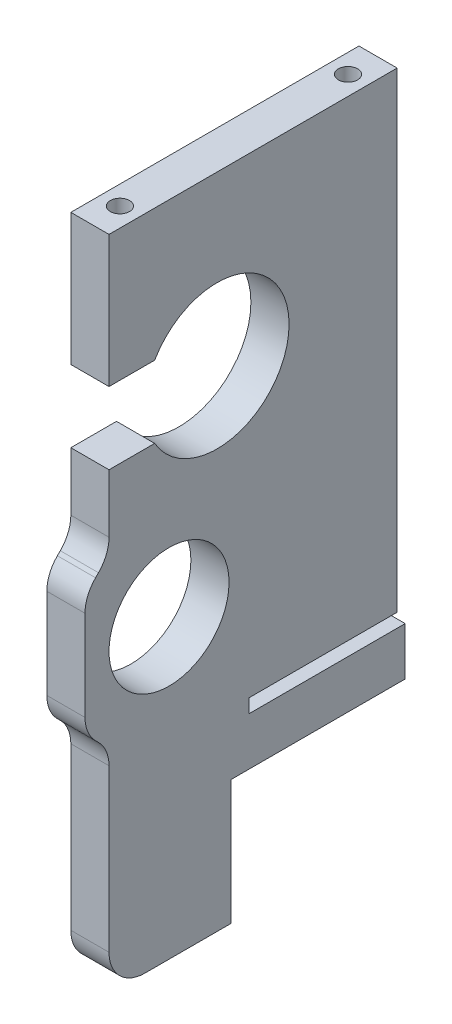
ISO-10303-21;
HEADER;
FILE_DESCRIPTION(('STEP AP214'),'2;1');
FILE_NAME('part.step','',(''),(''),'','','');
FILE_SCHEMA(('AUTOMOTIVE_DESIGN { 1 0 10303 214 1 1 1 1 }'));
ENDSEC;
DATA;
#1=APPLICATION_CONTEXT('core data for automotive mechanical design processes');
#2=APPLICATION_PROTOCOL_DEFINITION('international standard','automotive_design',2000,#1);
#3=PRODUCT_CONTEXT('',#1,'mechanical');
#4=PRODUCT('Part','Part','',(#3));
#5=PRODUCT_RELATED_PRODUCT_CATEGORY('part','',(#4));
#6=PRODUCT_DEFINITION_FORMATION('','',#4);
#7=PRODUCT_DEFINITION_CONTEXT('part definition',#1,'design');
#8=PRODUCT_DEFINITION('design','',#6,#7);
#9=PRODUCT_DEFINITION_SHAPE('','',#8);
#10=(LENGTH_UNIT() NAMED_UNIT(*) SI_UNIT(.MILLI.,.METRE.));
#11=(NAMED_UNIT(*) PLANE_ANGLE_UNIT() SI_UNIT($,.RADIAN.));
#12=(NAMED_UNIT(*) SI_UNIT($,.STERADIAN.) SOLID_ANGLE_UNIT());
#13=UNCERTAINTY_MEASURE_WITH_UNIT(LENGTH_MEASURE(1.E-05),#10,'distance_accuracy_value','');
#14=(GEOMETRIC_REPRESENTATION_CONTEXT(3) GLOBAL_UNCERTAINTY_ASSIGNED_CONTEXT((#13)) GLOBAL_UNIT_ASSIGNED_CONTEXT((#10,
#11,#12)) REPRESENTATION_CONTEXT('',''));
#15=CARTESIAN_POINT('',(0.,0.,0.));
#16=DIRECTION('',(0.,0.,1.));
#17=DIRECTION('',(1.,0.,0.));
#18=AXIS2_PLACEMENT_3D('',#15,#16,#17);
#19=CARTESIAN_POINT('',(3.18,43.8108658985171,0.));
#20=DIRECTION('',(0.,0.,-1.));
#21=DIRECTION('',(1.,0.,0.));
#22=AXIS2_PLACEMENT_3D('',#19,#20,#21);
#23=PLANE('',#22);
#24=DIRECTION('',(0.,1.,0.));
#25=VECTOR('',#24,1.);
#26=CARTESIAN_POINT('',(0.,43.8108658985171,0.));
#27=LINE('',#26,#25);
#28=CARTESIAN_POINT('',(0.,43.8108658985171,0.));
#29=VERTEX_POINT('',#28);
#30=CARTESIAN_POINT('',(0.,54.79,0.));
#31=VERTEX_POINT('',#30);
#32=EDGE_CURVE('E228',#29,#31,#27,.T.);
#33=ORIENTED_EDGE('',*,*,#32,.F.);
#34=DIRECTION('',(-1.,0.,0.));
#35=VECTOR('',#34,1.);
#36=CARTESIAN_POINT('',(3.18,43.8108658985171,0.));
#37=LINE('',#36,#35);
#38=CARTESIAN_POINT('',(3.18,43.8108658985171,0.));
#39=VERTEX_POINT('',#38);
#40=EDGE_CURVE('E280',#39,#29,#37,.T.);
#41=ORIENTED_EDGE('',*,*,#40,.F.);
#42=DIRECTION('',(0.,1.,0.));
#43=VECTOR('',#42,1.);
#44=CARTESIAN_POINT('',(3.18,43.8108658985171,0.));
#45=LINE('',#44,#43);
#46=CARTESIAN_POINT('',(3.18,54.79,0.));
#47=VERTEX_POINT('',#46);
#48=EDGE_CURVE('E231',#39,#47,#45,.T.);
#49=ORIENTED_EDGE('',*,*,#48,.T.);
#50=DIRECTION('',(-1.,0.,0.));
#51=VECTOR('',#50,1.);
#52=CARTESIAN_POINT('',(3.18,54.79,0.));
#53=LINE('',#52,#51);
#54=EDGE_CURVE('E362',#47,#31,#53,.T.);
#55=ORIENTED_EDGE('',*,*,#54,.T.);
#56=EDGE_LOOP('',(#33,#41,#49,#55));
#57=FACE_BOUND('',#56,.T.);
#58=ADVANCED_FACE('F46',(#57),#23,.F.);
#59=CARTESIAN_POINT('',(3.18,54.79,0.));
#60=DIRECTION('',(0.,-1.,0.));
#61=DIRECTION('',(0.,0.,-1.));
#62=AXIS2_PLACEMENT_3D('',#59,#60,#61);
#63=PLANE('',#62);
#64=CARTESIAN_POINT('',(1.59,54.79,-2.50000000000002));
#65=DIRECTION('',(0.,-1.,0.));
#66=DIRECTION('',(0.,0.,1.));
#67=AXIS2_PLACEMENT_3D('',#64,#65,#66);
#68=CIRCLE('',#67,0.8);
#69=CARTESIAN_POINT('',(1.59,54.79,-1.70000000000002));
#70=VERTEX_POINT('',#69);
#71=EDGE_CURVE('E214',#70,#70,#68,.T.);
#72=ORIENTED_EDGE('',*,*,#71,.T.);
#73=EDGE_LOOP('',(#72));
#74=FACE_BOUND('',#73,.T.);
#75=CARTESIAN_POINT('',(1.59,54.79,-21.5));
#76=DIRECTION('',(0.,-1.,0.));
#77=DIRECTION('',(0.,0.,1.));
#78=AXIS2_PLACEMENT_3D('',#75,#76,#77);
#79=CIRCLE('',#78,0.8);
#80=CARTESIAN_POINT('',(1.59,54.79,-20.7));
#81=VERTEX_POINT('',#80);
#82=EDGE_CURVE('E213',#81,#81,#79,.T.);
#83=ORIENTED_EDGE('',*,*,#82,.T.);
#84=EDGE_LOOP('',(#83));
#85=FACE_BOUND('',#84,.T.);
#86=DIRECTION('',(0.,0.,-1.));
#87=VECTOR('',#86,1.);
#88=CARTESIAN_POINT('',(0.,54.79,0.));
#89=LINE('',#88,#87);
#90=CARTESIAN_POINT('',(0.,54.79,-24.));
#91=VERTEX_POINT('',#90);
#92=EDGE_CURVE('E283',#31,#91,#89,.T.);
#93=ORIENTED_EDGE('',*,*,#92,.F.);
#94=ORIENTED_EDGE('',*,*,#54,.F.);
#95=DIRECTION('',(0.,0.,-1.));
#96=VECTOR('',#95,1.);
#97=CARTESIAN_POINT('',(3.18,54.79,0.));
#98=LINE('',#97,#96);
#99=CARTESIAN_POINT('',(3.18,54.79,-24.));
#100=VERTEX_POINT('',#99);
#101=EDGE_CURVE('E234',#47,#100,#98,.T.);
#102=ORIENTED_EDGE('',*,*,#101,.T.);
#103=DIRECTION('',(-1.,0.,0.));
#104=VECTOR('',#103,1.);
#105=CARTESIAN_POINT('',(3.18,54.79,-24.));
#106=LINE('',#105,#104);
#107=EDGE_CURVE('E359',#100,#91,#106,.T.);
#108=ORIENTED_EDGE('',*,*,#107,.T.);
#109=EDGE_LOOP('',(#93,#94,#102,#108));
#110=FACE_BOUND('',#109,.T.);
#111=ADVANCED_FACE('F480',(#74,#85,#110),#63,.F.);
#112=CARTESIAN_POINT('',(3.18,54.79,-24.));
#113=DIRECTION('',(0.,0.,1.));
#114=DIRECTION('',(-1.,0.,0.));
#115=AXIS2_PLACEMENT_3D('',#112,#113,#114);
#116=PLANE('',#115);
#117=DIRECTION('',(0.,-1.,0.));
#118=VECTOR('',#117,1.);
#119=CARTESIAN_POINT('',(0.,54.79,-24.));
#120=LINE('',#119,#118);
#121=CARTESIAN_POINT('',(0.,15.53,-24.));
#122=VERTEX_POINT('',#121);
#123=EDGE_CURVE('E286',#91,#122,#120,.T.);
#124=ORIENTED_EDGE('',*,*,#123,.F.);
#125=ORIENTED_EDGE('',*,*,#107,.F.);
#126=DIRECTION('',(0.,-1.,0.));
#127=VECTOR('',#126,1.);
#128=CARTESIAN_POINT('',(3.18,54.79,-24.));
#129=LINE('',#128,#127);
#130=CARTESIAN_POINT('',(3.18,15.53,-24.));
#131=VERTEX_POINT('',#130);
#132=EDGE_CURVE('E238',#100,#131,#129,.T.);
#133=ORIENTED_EDGE('',*,*,#132,.T.);
#134=DIRECTION('',(-1.,0.,0.));
#135=VECTOR('',#134,1.);
#136=CARTESIAN_POINT('',(3.18,15.53,-24.));
#137=LINE('',#136,#135);
#138=EDGE_CURVE('E356',#131,#122,#137,.T.);
#139=ORIENTED_EDGE('',*,*,#138,.T.);
#140=EDGE_LOOP('',(#124,#125,#133,#139));
#141=FACE_BOUND('',#140,.T.);
#142=ADVANCED_FACE('F475',(#141),#116,.F.);
#143=CARTESIAN_POINT('',(3.18,15.53,-11.67));
#144=DIRECTION('',(0.,-1.,0.));
#145=DIRECTION('',(0.,0.,-1.));
#146=AXIS2_PLACEMENT_3D('',#143,#144,#145);
#147=PLANE('',#146);
#148=DIRECTION('',(0.,0.,-1.));
#149=VECTOR('',#148,1.);
#150=CARTESIAN_POINT('',(0.,15.53,-11.67));
#151=LINE('',#150,#149);
#152=CARTESIAN_POINT('',(0.,15.53,-11.67));
#153=VERTEX_POINT('',#152);
#154=EDGE_CURVE('E289',#153,#122,#151,.T.);
#155=ORIENTED_EDGE('',*,*,#154,.T.);
#156=ORIENTED_EDGE('',*,*,#138,.F.);
#157=DIRECTION('',(0.,0.,-1.));
#158=VECTOR('',#157,1.);
#159=CARTESIAN_POINT('',(3.18,15.53,-11.67));
#160=LINE('',#159,#158);
#161=CARTESIAN_POINT('',(3.18,15.53,-11.67));
#162=VERTEX_POINT('',#161);
#163=EDGE_CURVE('E241',#162,#131,#160,.T.);
#164=ORIENTED_EDGE('',*,*,#163,.F.);
#165=DIRECTION('',(-1.,0.,0.));
#166=VECTOR('',#165,1.);
#167=CARTESIAN_POINT('',(3.18,15.53,-11.67));
#168=LINE('',#167,#166);
#169=EDGE_CURVE('E353',#162,#153,#168,.T.);
#170=ORIENTED_EDGE('',*,*,#169,.T.);
#171=EDGE_LOOP('',(#155,#156,#164,#170));
#172=FACE_BOUND('',#171,.T.);
#173=ADVANCED_FACE('F472',(#172),#147,.T.);
#174=CARTESIAN_POINT('',(3.18,15.53,-11.67));
#175=DIRECTION('',(0.,0.,1.));
#176=DIRECTION('',(0.,-1.,0.));
#177=AXIS2_PLACEMENT_3D('',#174,#175,#176);
#178=PLANE('',#177);
#179=DIRECTION('',(0.,-1.,0.));
#180=VECTOR('',#179,1.);
#181=CARTESIAN_POINT('',(0.,15.53,-11.67));
#182=LINE('',#181,#180);
#183=CARTESIAN_POINT('',(0.,14.38,-11.67));
#184=VERTEX_POINT('',#183);
#185=EDGE_CURVE('E291',#153,#184,#182,.T.);
#186=ORIENTED_EDGE('',*,*,#185,.F.);
#187=ORIENTED_EDGE('',*,*,#169,.F.);
#188=DIRECTION('',(0.,-1.,0.));
#189=VECTOR('',#188,1.);
#190=CARTESIAN_POINT('',(3.18,15.53,-11.67));
#191=LINE('',#190,#189);
#192=CARTESIAN_POINT('',(3.18,14.38,-11.67));
#193=VERTEX_POINT('',#192);
#194=EDGE_CURVE('E243',#162,#193,#191,.T.);
#195=ORIENTED_EDGE('',*,*,#194,.T.);
#196=DIRECTION('',(-1.,0.,0.));
#197=VECTOR('',#196,1.);
#198=CARTESIAN_POINT('',(3.18,14.38,-11.67));
#199=LINE('',#198,#197);
#200=EDGE_CURVE('E350',#193,#184,#199,.T.);
#201=ORIENTED_EDGE('',*,*,#200,.T.);
#202=EDGE_LOOP('',(#186,#187,#195,#201));
#203=FACE_BOUND('',#202,.T.);
#204=ADVANCED_FACE('F469',(#203),#178,.F.);
#205=CARTESIAN_POINT('',(3.18,14.38,-24.67));
#206=DIRECTION('',(0.,1.,0.));
#207=DIRECTION('',(0.,0.,1.));
#208=AXIS2_PLACEMENT_3D('',#205,#206,#207);
#209=PLANE('',#208);
#210=DIRECTION('',(0.,0.,1.));
#211=VECTOR('',#210,1.);
#212=CARTESIAN_POINT('',(0.,14.38,-24.67));
#213=LINE('',#212,#211);
#214=CARTESIAN_POINT('',(0.,14.38,-24.67));
#215=VERTEX_POINT('',#214);
#216=EDGE_CURVE('E294',#215,#184,#213,.T.);
#217=ORIENTED_EDGE('',*,*,#216,.T.);
#218=ORIENTED_EDGE('',*,*,#200,.F.);
#219=DIRECTION('',(0.,0.,1.));
#220=VECTOR('',#219,1.);
#221=CARTESIAN_POINT('',(3.18,14.38,-24.67));
#222=LINE('',#221,#220);
#223=CARTESIAN_POINT('',(3.18,14.38,-24.67));
#224=VERTEX_POINT('',#223);
#225=EDGE_CURVE('E246',#224,#193,#222,.T.);
#226=ORIENTED_EDGE('',*,*,#225,.F.);
#227=DIRECTION('',(-1.,0.,0.));
#228=VECTOR('',#227,1.);
#229=CARTESIAN_POINT('',(3.18,14.38,-24.67));
#230=LINE('',#229,#228);
#231=EDGE_CURVE('E347',#224,#215,#230,.T.);
#232=ORIENTED_EDGE('',*,*,#231,.T.);
#233=EDGE_LOOP('',(#217,#218,#226,#232));
#234=FACE_BOUND('',#233,.T.);
#235=ADVANCED_FACE('F464',(#234),#209,.T.);
#236=CARTESIAN_POINT('',(3.18,14.38,-24.67));
#237=DIRECTION('',(0.,0.,1.));
#238=DIRECTION('',(0.,-1.,0.));
#239=AXIS2_PLACEMENT_3D('',#236,#237,#238);
#240=PLANE('',#239);
#241=DIRECTION('',(0.,-1.,0.));
#242=VECTOR('',#241,1.);
#243=CARTESIAN_POINT('',(0.,14.38,-24.67));
#244=LINE('',#243,#242);
#245=CARTESIAN_POINT('',(0.,10.38,-24.67));
#246=VERTEX_POINT('',#245);
#247=EDGE_CURVE('E296',#215,#246,#244,.T.);
#248=ORIENTED_EDGE('',*,*,#247,.F.);
#249=ORIENTED_EDGE('',*,*,#231,.F.);
#250=DIRECTION('',(0.,-1.,0.));
#251=VECTOR('',#250,1.);
#252=CARTESIAN_POINT('',(3.18,14.38,-24.67));
#253=LINE('',#252,#251);
#254=CARTESIAN_POINT('',(3.18,10.38,-24.67));
#255=VERTEX_POINT('',#254);
#256=EDGE_CURVE('E248',#224,#255,#253,.T.);
#257=ORIENTED_EDGE('',*,*,#256,.T.);
#258=DIRECTION('',(-1.,0.,0.));
#259=VECTOR('',#258,1.);
#260=CARTESIAN_POINT('',(3.18,10.38,-24.67));
#261=LINE('',#260,#259);
#262=EDGE_CURVE('E344',#255,#246,#261,.T.);
#263=ORIENTED_EDGE('',*,*,#262,.T.);
#264=EDGE_LOOP('',(#248,#249,#257,#263));
#265=FACE_BOUND('',#264,.T.);
#266=ADVANCED_FACE('F459',(#265),#240,.F.);
#267=CARTESIAN_POINT('',(3.18,10.38,-10.17));
#268=DIRECTION('',(0.,-1.,0.));
#269=DIRECTION('',(0.,0.,-1.));
#270=AXIS2_PLACEMENT_3D('',#267,#268,#269);
#271=PLANE('',#270);
#272=DIRECTION('',(0.,0.,-1.));
#273=VECTOR('',#272,1.);
#274=CARTESIAN_POINT('',(0.,10.38,-10.17));
#275=LINE('',#274,#273);
#276=CARTESIAN_POINT('',(0.,10.38,-10.17));
#277=VERTEX_POINT('',#276);
#278=EDGE_CURVE('E299',#277,#246,#275,.T.);
#279=ORIENTED_EDGE('',*,*,#278,.T.);
#280=ORIENTED_EDGE('',*,*,#262,.F.);
#281=DIRECTION('',(0.,0.,-1.));
#282=VECTOR('',#281,1.);
#283=CARTESIAN_POINT('',(3.18,10.38,-10.17));
#284=LINE('',#283,#282);
#285=CARTESIAN_POINT('',(3.18,10.38,-10.17));
#286=VERTEX_POINT('',#285);
#287=EDGE_CURVE('E251',#286,#255,#284,.T.);
#288=ORIENTED_EDGE('',*,*,#287,.F.);
#289=DIRECTION('',(-1.,0.,0.));
#290=VECTOR('',#289,1.);
#291=CARTESIAN_POINT('',(3.18,10.38,-10.17));
#292=LINE('',#291,#290);
#293=EDGE_CURVE('E341',#286,#277,#292,.T.);
#294=ORIENTED_EDGE('',*,*,#293,.T.);
#295=EDGE_LOOP('',(#279,#280,#288,#294));
#296=FACE_BOUND('',#295,.T.);
#297=ADVANCED_FACE('F456',(#296),#271,.T.);
#298=CARTESIAN_POINT('',(3.18,0.,-10.17));
#299=DIRECTION('',(0.,0.,-1.));
#300=DIRECTION('',(0.,1.,0.));
#301=AXIS2_PLACEMENT_3D('',#298,#299,#300);
#302=PLANE('',#301);
#303=DIRECTION('',(0.,1.,0.));
#304=VECTOR('',#303,1.);
#305=CARTESIAN_POINT('',(0.,0.,-10.17));
#306=LINE('',#305,#304);
#307=CARTESIAN_POINT('',(0.,0.,-10.17));
#308=VERTEX_POINT('',#307);
#309=EDGE_CURVE('E301',#308,#277,#306,.T.);
#310=ORIENTED_EDGE('',*,*,#309,.T.);
#311=ORIENTED_EDGE('',*,*,#293,.F.);
#312=DIRECTION('',(0.,1.,0.));
#313=VECTOR('',#312,1.);
#314=CARTESIAN_POINT('',(3.18,0.,-10.17));
#315=LINE('',#314,#313);
#316=CARTESIAN_POINT('',(3.18,0.,-10.17));
#317=VERTEX_POINT('',#316);
#318=EDGE_CURVE('E253',#317,#286,#315,.T.);
#319=ORIENTED_EDGE('',*,*,#318,.F.);
#320=DIRECTION('',(-1.,0.,0.));
#321=VECTOR('',#320,1.);
#322=CARTESIAN_POINT('',(3.18,0.,-10.17));
#323=LINE('',#322,#321);
#324=EDGE_CURVE('E338',#317,#308,#323,.T.);
#325=ORIENTED_EDGE('',*,*,#324,.T.);
#326=EDGE_LOOP('',(#310,#311,#319,#325));
#327=FACE_BOUND('',#326,.T.);
#328=ADVANCED_FACE('F451',(#327),#302,.T.);
#329=CARTESIAN_POINT('',(3.18,0.,-10.17));
#330=DIRECTION('',(0.,1.,0.));
#331=DIRECTION('',(0.,0.,1.));
#332=AXIS2_PLACEMENT_3D('',#329,#330,#331);
#333=PLANE('',#332);
#334=DIRECTION('',(0.,0.,1.));
#335=VECTOR('',#334,1.);
#336=CARTESIAN_POINT('',(0.,0.,-10.17));
#337=LINE('',#336,#335);
#338=CARTESIAN_POINT('',(0.,0.,-3.));
#339=VERTEX_POINT('',#338);
#340=EDGE_CURVE('E303',#308,#339,#337,.T.);
#341=ORIENTED_EDGE('',*,*,#340,.F.);
#342=ORIENTED_EDGE('',*,*,#324,.F.);
#343=DIRECTION('',(0.,0.,1.));
#344=VECTOR('',#343,1.);
#345=CARTESIAN_POINT('',(3.18,0.,-10.17));
#346=LINE('',#345,#344);
#347=CARTESIAN_POINT('',(3.18,0.,-3.));
#348=VERTEX_POINT('',#347);
#349=EDGE_CURVE('E255',#317,#348,#346,.T.);
#350=ORIENTED_EDGE('',*,*,#349,.T.);
#351=DIRECTION('',(-1.,0.,0.));
#352=VECTOR('',#351,1.);
#353=CARTESIAN_POINT('',(3.18,0.,-3.));
#354=LINE('',#353,#352);
#355=EDGE_CURVE('E377',#339,#348,#354,.F.);
#356=ORIENTED_EDGE('',*,*,#355,.F.);
#357=EDGE_LOOP('',(#341,#342,#350,#356));
#358=FACE_BOUND('',#357,.T.);
#359=ADVANCED_FACE('F446',(#358),#333,.F.);
#360=CARTESIAN_POINT('',(3.18,17.7,0.));
#361=DIRECTION('',(0.,0.,1.));
#362=DIRECTION('',(0.,-1.,0.));
#363=AXIS2_PLACEMENT_3D('',#360,#361,#362);
#364=PLANE('',#363);
#365=DIRECTION('',(0.,-1.,0.));
#366=VECTOR('',#365,1.);
#367=CARTESIAN_POINT('',(3.18,17.7,0.));
#368=LINE('',#367,#366);
#369=CARTESIAN_POINT('',(3.18,16.4573593128807,0.));
#370=VERTEX_POINT('',#369);
#371=CARTESIAN_POINT('',(3.18,3.,0.));
#372=VERTEX_POINT('',#371);
#373=EDGE_CURVE('E258',#370,#372,#368,.T.);
#374=ORIENTED_EDGE('',*,*,#373,.F.);
#375=DIRECTION('',(-1.,0.,0.));
#376=VECTOR('',#375,1.);
#377=CARTESIAN_POINT('',(3.18,16.4573593128807,0.));
#378=LINE('',#377,#376);
#379=CARTESIAN_POINT('',(0.,16.4573593128807,0.));
#380=VERTEX_POINT('',#379);
#381=EDGE_CURVE('E365',#380,#370,#378,.F.);
#382=ORIENTED_EDGE('',*,*,#381,.F.);
#383=DIRECTION('',(0.,-1.,0.));
#384=VECTOR('',#383,1.);
#385=CARTESIAN_POINT('',(0.,17.7,0.));
#386=LINE('',#385,#384);
#387=CARTESIAN_POINT('',(0.,3.,0.));
#388=VERTEX_POINT('',#387);
#389=EDGE_CURVE('E306',#380,#388,#386,.T.);
#390=ORIENTED_EDGE('',*,*,#389,.T.);
#391=DIRECTION('',(-1.,0.,0.));
#392=VECTOR('',#391,1.);
#393=CARTESIAN_POINT('',(0.,3.,0.));
#394=LINE('',#393,#392);
#395=EDGE_CURVE('E368',#372,#388,#394,.T.);
#396=ORIENTED_EDGE('',*,*,#395,.F.);
#397=EDGE_LOOP('',(#374,#382,#390,#396));
#398=FACE_BOUND('',#397,.T.);
#399=ADVANCED_FACE('F440',(#398),#364,.T.);
#400=CARTESIAN_POINT('',(3.18,19.7,2.));
#401=DIRECTION('',(0.,-0.707106781186557,0.707106781186538));
#402=DIRECTION('',(0.,-0.707106781186538,-0.707106781186557));
#403=AXIS2_PLACEMENT_3D('',#400,#401,#402);
#404=PLANE('',#403);
#405=DIRECTION('',(0.,-0.707106781186538,-0.707106781186557));
#406=VECTOR('',#405,1.);
#407=CARTESIAN_POINT('',(3.18,19.7,2.));
#408=LINE('',#407,#406);
#409=CARTESIAN_POINT('',(3.18,18.8213203435596,1.12132034355961));
#410=VERTEX_POINT('',#409);
#411=CARTESIAN_POINT('',(3.18,18.5786796564404,0.878679656440382));
#412=VERTEX_POINT('',#411);
#413=EDGE_CURVE('E261',#410,#412,#408,.T.);
#414=ORIENTED_EDGE('',*,*,#413,.F.);
#415=DIRECTION('',(-1.,0.,0.));
#416=VECTOR('',#415,1.);
#417=CARTESIAN_POINT('',(3.18,18.8213203435596,1.12132034355961));
#418=LINE('',#417,#416);
#419=CARTESIAN_POINT('',(0.,18.8213203435596,1.12132034355961));
#420=VERTEX_POINT('',#419);
#421=EDGE_CURVE('E386',#420,#410,#418,.F.);
#422=ORIENTED_EDGE('',*,*,#421,.F.);
#423=DIRECTION('',(0.,-0.707106781186538,-0.707106781186557));
#424=VECTOR('',#423,1.);
#425=CARTESIAN_POINT('',(0.,19.7,2.));
#426=LINE('',#425,#424);
#427=CARTESIAN_POINT('',(0.,18.5786796564404,0.878679656440382));
#428=VERTEX_POINT('',#427);
#429=EDGE_CURVE('E309',#420,#428,#426,.T.);
#430=ORIENTED_EDGE('',*,*,#429,.T.);
#431=DIRECTION('',(-1.,0.,0.));
#432=VECTOR('',#431,1.);
#433=CARTESIAN_POINT('',(0.,18.5786796564404,0.878679656440383));
#434=LINE('',#433,#432);
#435=EDGE_CURVE('E389',#412,#428,#434,.T.);
#436=ORIENTED_EDGE('',*,*,#435,.F.);
#437=EDGE_LOOP('',(#414,#422,#430,#436));
#438=FACE_BOUND('',#437,.T.);
#439=ADVANCED_FACE('F433',(#438),#404,.T.);
#440=CARTESIAN_POINT('',(3.18,19.7,2.));
#441=DIRECTION('',(0.,0.,-1.));
#442=DIRECTION('',(0.,1.,0.));
#443=AXIS2_PLACEMENT_3D('',#440,#441,#442);
#444=PLANE('',#443);
#445=DIRECTION('',(0.,1.,0.));
#446=VECTOR('',#445,1.);
#447=CARTESIAN_POINT('',(3.18,19.7,2.));
#448=LINE('',#447,#446);
#449=CARTESIAN_POINT('',(3.18,20.9426406871193,2.));
#450=VERTEX_POINT('',#449);
#451=CARTESIAN_POINT('',(3.18,28.4573593128807,2.));
#452=VERTEX_POINT('',#451);
#453=EDGE_CURVE('E264',#450,#452,#448,.T.);
#454=ORIENTED_EDGE('',*,*,#453,.T.);
#455=DIRECTION('',(-1.,0.,0.));
#456=VECTOR('',#455,1.);
#457=CARTESIAN_POINT('',(3.18,28.4573593128807,2.));
#458=LINE('',#457,#456);
#459=CARTESIAN_POINT('',(0.,28.4573593128807,2.));
#460=VERTEX_POINT('',#459);
#461=EDGE_CURVE('E392',#460,#452,#458,.F.);
#462=ORIENTED_EDGE('',*,*,#461,.F.);
#463=DIRECTION('',(0.,1.,0.));
#464=VECTOR('',#463,1.);
#465=CARTESIAN_POINT('',(0.,19.7,2.));
#466=LINE('',#465,#464);
#467=CARTESIAN_POINT('',(0.,20.9426406871193,2.));
#468=VERTEX_POINT('',#467);
#469=EDGE_CURVE('E312',#468,#460,#466,.T.);
#470=ORIENTED_EDGE('',*,*,#469,.F.);
#471=DIRECTION('',(-1.,0.,0.));
#472=VECTOR('',#471,1.);
#473=CARTESIAN_POINT('',(0.,20.9426406871193,2.));
#474=LINE('',#473,#472);
#475=EDGE_CURVE('E395',#450,#468,#474,.T.);
#476=ORIENTED_EDGE('',*,*,#475,.F.);
#477=EDGE_LOOP('',(#454,#462,#470,#476));
#478=FACE_BOUND('',#477,.T.);
#479=ADVANCED_FACE('F425',(#478),#444,.F.);
#480=CARTESIAN_POINT('',(3.18,29.7,2.));
#481=DIRECTION('',(0.,-0.707106781186556,-0.707106781186539));
#482=DIRECTION('',(0.,0.707106781186539,-0.707106781186556));
#483=AXIS2_PLACEMENT_3D('',#480,#481,#482);
#484=PLANE('',#483);
#485=DIRECTION('',(0.,0.707106781186539,-0.707106781186556));
#486=VECTOR('',#485,1.);
#487=CARTESIAN_POINT('',(3.18,29.7,2.));
#488=LINE('',#487,#486);
#489=CARTESIAN_POINT('',(3.18,30.5786796564404,1.12132034355961));
#490=VERTEX_POINT('',#489);
#491=CARTESIAN_POINT('',(3.18,30.8213203435596,0.878679656440383));
#492=VERTEX_POINT('',#491);
#493=EDGE_CURVE('E267',#490,#492,#488,.T.);
#494=ORIENTED_EDGE('',*,*,#493,.T.);
#495=DIRECTION('',(-1.,0.,0.));
#496=VECTOR('',#495,1.);
#497=CARTESIAN_POINT('',(3.18,30.8213203435596,0.878679656440383));
#498=LINE('',#497,#496);
#499=CARTESIAN_POINT('',(0.,30.8213203435596,0.878679656440383));
#500=VERTEX_POINT('',#499);
#501=EDGE_CURVE('E398',#500,#492,#498,.F.);
#502=ORIENTED_EDGE('',*,*,#501,.F.);
#503=DIRECTION('',(0.,0.707106781186539,-0.707106781186556));
#504=VECTOR('',#503,1.);
#505=CARTESIAN_POINT('',(0.,29.7,2.));
#506=LINE('',#505,#504);
#507=CARTESIAN_POINT('',(0.,30.5786796564404,1.12132034355961));
#508=VERTEX_POINT('',#507);
#509=EDGE_CURVE('E315',#508,#500,#506,.T.);
#510=ORIENTED_EDGE('',*,*,#509,.F.);
#511=DIRECTION('',(-1.,0.,0.));
#512=VECTOR('',#511,1.);
#513=CARTESIAN_POINT('',(3.18,30.5786796564404,1.12132034355961));
#514=LINE('',#513,#512);
#515=EDGE_CURVE('E400',#490,#508,#514,.T.);
#516=ORIENTED_EDGE('',*,*,#515,.F.);
#517=EDGE_LOOP('',(#494,#502,#510,#516));
#518=FACE_BOUND('',#517,.T.);
#519=ADVANCED_FACE('F416',(#518),#484,.F.);
#520=CARTESIAN_POINT('',(3.18,31.6999999999999,0.));
#521=DIRECTION('',(0.,0.,-1.));
#522=DIRECTION('',(0.,1.,0.));
#523=AXIS2_PLACEMENT_3D('',#520,#521,#522);
#524=PLANE('',#523);
#525=DIRECTION('',(0.,1.,0.));
#526=VECTOR('',#525,1.);
#527=CARTESIAN_POINT('',(3.18,31.6999999999999,0.));
#528=LINE('',#527,#526);
#529=CARTESIAN_POINT('',(3.18,32.9426406871193,0.));
#530=VERTEX_POINT('',#529);
#531=CARTESIAN_POINT('',(3.18,37.8108658985171,0.));
#532=VERTEX_POINT('',#531);
#533=EDGE_CURVE('E270',#530,#532,#528,.T.);
#534=ORIENTED_EDGE('',*,*,#533,.T.);
#535=DIRECTION('',(-1.,0.,0.));
#536=VECTOR('',#535,1.);
#537=CARTESIAN_POINT('',(3.18,37.8108658985171,0.));
#538=LINE('',#537,#536);
#539=CARTESIAN_POINT('',(0.,37.8108658985171,0.));
#540=VERTEX_POINT('',#539);
#541=EDGE_CURVE('E335',#532,#540,#538,.T.);
#542=ORIENTED_EDGE('',*,*,#541,.T.);
#543=DIRECTION('',(0.,1.,0.));
#544=VECTOR('',#543,1.);
#545=CARTESIAN_POINT('',(0.,31.6999999999999,0.));
#546=LINE('',#545,#544);
#547=CARTESIAN_POINT('',(0.,32.9426406871193,0.));
#548=VERTEX_POINT('',#547);
#549=EDGE_CURVE('E318',#548,#540,#546,.T.);
#550=ORIENTED_EDGE('',*,*,#549,.F.);
#551=DIRECTION('',(-1.,0.,0.));
#552=VECTOR('',#551,1.);
#553=CARTESIAN_POINT('',(0.,32.9426406871193,0.));
#554=LINE('',#553,#552);
#555=EDGE_CURVE('E403',#530,#548,#554,.T.);
#556=ORIENTED_EDGE('',*,*,#555,.F.);
#557=EDGE_LOOP('',(#534,#542,#550,#556));
#558=FACE_BOUND('',#557,.T.);
#559=ADVANCED_FACE('F495',(#558),#524,.F.);
#560=CARTESIAN_POINT('',(3.18,37.8108658985171,-3.80384757729332));
#561=DIRECTION('',(0.,1.,0.));
#562=DIRECTION('',(0.,0.,1.));
#563=AXIS2_PLACEMENT_3D('',#560,#561,#562);
#564=PLANE('',#563);
#565=DIRECTION('',(0.,0.,1.));
#566=VECTOR('',#565,1.);
#567=CARTESIAN_POINT('',(0.,37.8108658985171,-3.80384757729332));
#568=LINE('',#567,#566);
#569=CARTESIAN_POINT('',(0.,37.8108658985171,-3.80384757729332));
#570=VERTEX_POINT('',#569);
#571=EDGE_CURVE('E321',#570,#540,#568,.T.);
#572=ORIENTED_EDGE('',*,*,#571,.T.);
#573=ORIENTED_EDGE('',*,*,#541,.F.);
#574=DIRECTION('',(0.,0.,1.));
#575=VECTOR('',#574,1.);
#576=CARTESIAN_POINT('',(3.18,37.8108658985171,-3.80384757729332));
#577=LINE('',#576,#575);
#578=CARTESIAN_POINT('',(3.18,37.8108658985171,-3.80384757729332));
#579=VERTEX_POINT('',#578);
#580=EDGE_CURVE('E273',#579,#532,#577,.T.);
#581=ORIENTED_EDGE('',*,*,#580,.F.);
#582=DIRECTION('',(-1.,0.,0.));
#583=VECTOR('',#582,1.);
#584=CARTESIAN_POINT('',(3.18,37.8108658985171,-3.80384757729332));
#585=LINE('',#584,#583);
#586=EDGE_CURVE('E332',#579,#570,#585,.T.);
#587=ORIENTED_EDGE('',*,*,#586,.T.);
#588=EDGE_LOOP('',(#572,#573,#581,#587));
#589=FACE_BOUND('',#588,.T.);
#590=ADVANCED_FACE('F493',(#589),#564,.T.);
#591=CARTESIAN_POINT('',(3.18,40.8108658985171,-8.99999999999995));
#592=DIRECTION('',(-1.,0.,0.));
#593=DIRECTION('',(0.,0.,-1.));
#594=AXIS2_PLACEMENT_3D('',#591,#592,#593);
#595=CYLINDRICAL_SURFACE('',#594,6.);
#596=CARTESIAN_POINT('',(0.,40.8108658985171,-8.99999999999995));
#597=DIRECTION('',(1.,0.,0.));
#598=DIRECTION('',(0.,0.,-1.));
#599=AXIS2_PLACEMENT_3D('',#596,#597,#598);
#600=CIRCLE('',#599,6.);
#601=CARTESIAN_POINT('',(0.,43.8108658985171,-3.80384757729332));
#602=VERTEX_POINT('',#601);
#603=EDGE_CURVE('E323',#570,#602,#600,.T.);
#604=ORIENTED_EDGE('',*,*,#603,.F.);
#605=ORIENTED_EDGE('',*,*,#586,.F.);
#606=CARTESIAN_POINT('',(3.18,40.8108658985171,-8.99999999999995));
#607=DIRECTION('',(1.,0.,0.));
#608=DIRECTION('',(0.,0.,-1.));
#609=AXIS2_PLACEMENT_3D('',#606,#607,#608);
#610=CIRCLE('',#609,6.);
#611=CARTESIAN_POINT('',(3.18,43.8108658985171,-3.80384757729332));
#612=VERTEX_POINT('',#611);
#613=EDGE_CURVE('E275',#579,#612,#610,.T.);
#614=ORIENTED_EDGE('',*,*,#613,.T.);
#615=DIRECTION('',(-1.,0.,0.));
#616=VECTOR('',#615,1.);
#617=CARTESIAN_POINT('',(3.18,43.8108658985171,-3.80384757729332));
#618=LINE('',#617,#616);
#619=EDGE_CURVE('E329',#612,#602,#618,.T.);
#620=ORIENTED_EDGE('',*,*,#619,.T.);
#621=EDGE_LOOP('',(#604,#605,#614,#620));
#622=FACE_BOUND('',#621,.T.);
#623=ADVANCED_FACE('F490',(#622),#595,.F.);
#624=CARTESIAN_POINT('',(3.18,43.8108658985171,-3.80384757729331));
#625=DIRECTION('',(0.,1.,0.));
#626=DIRECTION('',(0.,0.,1.));
#627=AXIS2_PLACEMENT_3D('',#624,#625,#626);
#628=PLANE('',#627);
#629=DIRECTION('',(0.,0.,1.));
#630=VECTOR('',#629,1.);
#631=CARTESIAN_POINT('',(0.,43.8108658985171,-3.80384757729331));
#632=LINE('',#631,#630);
#633=EDGE_CURVE('E235',#602,#29,#632,.T.);
#634=ORIENTED_EDGE('',*,*,#633,.F.);
#635=ORIENTED_EDGE('',*,*,#619,.F.);
#636=DIRECTION('',(0.,0.,1.));
#637=VECTOR('',#636,1.);
#638=CARTESIAN_POINT('',(3.18,43.8108658985171,-3.80384757729331));
#639=LINE('',#638,#637);
#640=EDGE_CURVE('E278',#612,#39,#639,.T.);
#641=ORIENTED_EDGE('',*,*,#640,.T.);
#642=ORIENTED_EDGE('',*,*,#40,.T.);
#643=EDGE_LOOP('',(#634,#635,#641,#642));
#644=FACE_BOUND('',#643,.T.);
#645=ADVANCED_FACE('F484',(#644),#628,.F.);
#646=CARTESIAN_POINT('',(3.18,40.8108658985171,-8.99999999999995));
#647=DIRECTION('',(-1.,0.,0.));
#648=DIRECTION('',(0.,0.,-1.));
#649=AXIS2_PLACEMENT_3D('',#646,#647,#648);
#650=PLANE('',#649);
#651=CARTESIAN_POINT('',(3.18,24.7,-5.));
#652=DIRECTION('',(1.,0.,0.));
#653=DIRECTION('',(0.,0.,-1.));
#654=AXIS2_PLACEMENT_3D('',#651,#652,#653);
#655=CIRCLE('',#654,5.);
#656=CARTESIAN_POINT('',(3.18,24.7,-10.));
#657=VERTEX_POINT('',#656);
#658=EDGE_CURVE('E225',#657,#657,#655,.T.);
#659=ORIENTED_EDGE('',*,*,#658,.F.);
#660=EDGE_LOOP('',(#659));
#661=FACE_BOUND('',#660,.T.);
#662=ORIENTED_EDGE('',*,*,#349,.F.);
#663=ORIENTED_EDGE('',*,*,#318,.T.);
#664=ORIENTED_EDGE('',*,*,#287,.T.);
#665=ORIENTED_EDGE('',*,*,#256,.F.);
#666=ORIENTED_EDGE('',*,*,#225,.T.);
#667=ORIENTED_EDGE('',*,*,#194,.F.);
#668=ORIENTED_EDGE('',*,*,#163,.T.);
#669=ORIENTED_EDGE('',*,*,#132,.F.);
#670=ORIENTED_EDGE('',*,*,#101,.F.);
#671=ORIENTED_EDGE('',*,*,#48,.F.);
#672=ORIENTED_EDGE('',*,*,#640,.F.);
#673=ORIENTED_EDGE('',*,*,#613,.F.);
#674=ORIENTED_EDGE('',*,*,#580,.T.);
#675=ORIENTED_EDGE('',*,*,#533,.F.);
#676=CARTESIAN_POINT('',(3.18,32.9426406871193,3.));
#677=DIRECTION('',(1.,0.,0.));
#678=DIRECTION('',(0.,0.,-1.));
#679=AXIS2_PLACEMENT_3D('',#676,#677,#678);
#680=CIRCLE('',#679,3.);
#681=EDGE_CURVE('E13',#492,#530,#680,.T.);
#682=ORIENTED_EDGE('',*,*,#681,.F.);
#683=ORIENTED_EDGE('',*,*,#493,.F.);
#684=CARTESIAN_POINT('',(3.18,28.4573593128807,-1.));
#685=DIRECTION('',(1.,0.,0.));
#686=DIRECTION('',(0.,0.,-1.));
#687=AXIS2_PLACEMENT_3D('',#684,#685,#686);
#688=CIRCLE('',#687,3.);
#689=EDGE_CURVE('E380',#452,#490,#688,.F.);
#690=ORIENTED_EDGE('',*,*,#689,.F.);
#691=ORIENTED_EDGE('',*,*,#453,.F.);
#692=CARTESIAN_POINT('',(3.18,20.9426406871193,-1.));
#693=DIRECTION('',(1.,0.,0.));
#694=DIRECTION('',(0.,0.,-1.));
#695=AXIS2_PLACEMENT_3D('',#692,#693,#694);
#696=CIRCLE('',#695,3.);
#697=EDGE_CURVE('E382',#410,#450,#696,.F.);
#698=ORIENTED_EDGE('',*,*,#697,.F.);
#699=ORIENTED_EDGE('',*,*,#413,.T.);
#700=CARTESIAN_POINT('',(3.18,16.4573593128807,3.));
#701=DIRECTION('',(1.,0.,0.));
#702=DIRECTION('',(0.,0.,-1.));
#703=AXIS2_PLACEMENT_3D('',#700,#701,#702);
#704=CIRCLE('',#703,3.);
#705=EDGE_CURVE('E407',#370,#412,#704,.T.);
#706=ORIENTED_EDGE('',*,*,#705,.F.);
#707=ORIENTED_EDGE('',*,*,#373,.T.);
#708=CARTESIAN_POINT('',(3.18,3.,-3.));
#709=DIRECTION('',(1.,0.,0.));
#710=DIRECTION('',(0.,0.,-1.));
#711=AXIS2_PLACEMENT_3D('',#708,#709,#710);
#712=CIRCLE('',#711,3.);
#713=EDGE_CURVE('E384',#348,#372,#712,.F.);
#714=ORIENTED_EDGE('',*,*,#713,.F.);
#715=EDGE_LOOP('',(#662,#663,#664,#665,#666,#667,#668,#669,#670,#671,#672,#673,#674,#675,#682,
#683,#690,#691,#698,#699,#706,#707,#714));
#716=FACE_BOUND('',#715,.T.);
#717=ADVANCED_FACE('F417',(#661,#716),#650,.F.);
#718=CARTESIAN_POINT('',(0.,40.8108658985171,-8.99999999999995));
#719=DIRECTION('',(-1.,0.,0.));
#720=DIRECTION('',(0.,0.,-1.));
#721=AXIS2_PLACEMENT_3D('',#718,#719,#720);
#722=PLANE('',#721);
#723=CARTESIAN_POINT('',(0.,24.7,-5.));
#724=DIRECTION('',(1.,0.,0.));
#725=DIRECTION('',(0.,0.,-1.));
#726=AXIS2_PLACEMENT_3D('',#723,#724,#725);
#727=CIRCLE('',#726,5.);
#728=CARTESIAN_POINT('',(0.,24.7,-10.));
#729=VERTEX_POINT('',#728);
#730=EDGE_CURVE('E224',#729,#729,#727,.T.);
#731=ORIENTED_EDGE('',*,*,#730,.T.);
#732=EDGE_LOOP('',(#731));
#733=FACE_BOUND('',#732,.T.);
#734=ORIENTED_EDGE('',*,*,#389,.F.);
#735=CARTESIAN_POINT('',(0.,16.4573593128807,3.));
#736=DIRECTION('',(1.,0.,0.));
#737=DIRECTION('',(0.,0.,-1.));
#738=AXIS2_PLACEMENT_3D('',#735,#736,#737);
#739=CIRCLE('',#738,3.);
#740=EDGE_CURVE('E405',#428,#380,#739,.F.);
#741=ORIENTED_EDGE('',*,*,#740,.F.);
#742=ORIENTED_EDGE('',*,*,#429,.F.);
#743=CARTESIAN_POINT('',(0.,20.9426406871193,-1.));
#744=DIRECTION('',(1.,0.,0.));
#745=DIRECTION('',(0.,0.,-1.));
#746=AXIS2_PLACEMENT_3D('',#743,#744,#745);
#747=CIRCLE('',#746,3.);
#748=EDGE_CURVE('E373',#468,#420,#747,.T.);
#749=ORIENTED_EDGE('',*,*,#748,.F.);
#750=ORIENTED_EDGE('',*,*,#469,.T.);
#751=CARTESIAN_POINT('',(0.,28.4573593128807,-1.));
#752=DIRECTION('',(1.,0.,0.));
#753=DIRECTION('',(0.,0.,-1.));
#754=AXIS2_PLACEMENT_3D('',#751,#752,#753);
#755=CIRCLE('',#754,3.);
#756=EDGE_CURVE('E371',#508,#460,#755,.T.);
#757=ORIENTED_EDGE('',*,*,#756,.F.);
#758=ORIENTED_EDGE('',*,*,#509,.T.);
#759=CARTESIAN_POINT('',(0.,32.9426406871193,3.));
#760=DIRECTION('',(1.,0.,0.));
#761=DIRECTION('',(0.,0.,-1.));
#762=AXIS2_PLACEMENT_3D('',#759,#760,#761);
#763=CIRCLE('',#762,3.);
#764=EDGE_CURVE('E54',#548,#500,#763,.F.);
#765=ORIENTED_EDGE('',*,*,#764,.F.);
#766=ORIENTED_EDGE('',*,*,#549,.T.);
#767=ORIENTED_EDGE('',*,*,#571,.F.);
#768=ORIENTED_EDGE('',*,*,#603,.T.);
#769=ORIENTED_EDGE('',*,*,#633,.T.);
#770=ORIENTED_EDGE('',*,*,#32,.T.);
#771=ORIENTED_EDGE('',*,*,#92,.T.);
#772=ORIENTED_EDGE('',*,*,#123,.T.);
#773=ORIENTED_EDGE('',*,*,#154,.F.);
#774=ORIENTED_EDGE('',*,*,#185,.T.);
#775=ORIENTED_EDGE('',*,*,#216,.F.);
#776=ORIENTED_EDGE('',*,*,#247,.T.);
#777=ORIENTED_EDGE('',*,*,#278,.F.);
#778=ORIENTED_EDGE('',*,*,#309,.F.);
#779=ORIENTED_EDGE('',*,*,#340,.T.);
#780=CARTESIAN_POINT('',(0.,3.,-3.));
#781=DIRECTION('',(1.,0.,0.));
#782=DIRECTION('',(0.,0.,-1.));
#783=AXIS2_PLACEMENT_3D('',#780,#781,#782);
#784=CIRCLE('',#783,3.);
#785=EDGE_CURVE('E375',#388,#339,#784,.T.);
#786=ORIENTED_EDGE('',*,*,#785,.F.);
#787=EDGE_LOOP('',(#734,#741,#742,#749,#750,#757,#758,#765,#766,#767,#768,#769,#770,#771,#772,
#773,#774,#775,#776,#777,#778,#779,#786));
#788=FACE_BOUND('',#787,.T.);
#789=ADVANCED_FACE('F413',(#733,#788),#722,.T.);
#790=CARTESIAN_POINT('',(3.18,24.7,-5.));
#791=DIRECTION('',(-1.,0.,0.));
#792=DIRECTION('',(0.,0.,-1.));
#793=AXIS2_PLACEMENT_3D('',#790,#791,#792);
#794=CYLINDRICAL_SURFACE('',#793,5.);
#795=CARTESIAN_POINT('',(3.18,24.7,-10.));
#796=CARTESIAN_POINT('',(3.146875,24.7,-10.));
#797=CARTESIAN_POINT('',(3.11375,24.7,-10.));
#798=CARTESIAN_POINT('',(3.0475,24.7,-10.));
#799=CARTESIAN_POINT('',(3.014375,24.7,-10.));
#800=CARTESIAN_POINT('',(2.948125,24.7,-10.));
#801=CARTESIAN_POINT('',(2.915,24.7,-10.));
#802=CARTESIAN_POINT('',(2.84875,24.7,-10.));
#803=CARTESIAN_POINT('',(2.815625,24.7,-10.));
#804=CARTESIAN_POINT('',(2.749375,24.7,-10.));
#805=CARTESIAN_POINT('',(2.71625,24.7,-10.));
#806=CARTESIAN_POINT('',(2.65,24.7,-10.));
#807=CARTESIAN_POINT('',(2.616875,24.7,-10.));
#808=CARTESIAN_POINT('',(2.550625,24.7,-10.));
#809=CARTESIAN_POINT('',(2.5175,24.7,-10.));
#810=CARTESIAN_POINT('',(2.45125,24.7,-10.));
#811=CARTESIAN_POINT('',(2.418125,24.7,-10.));
#812=CARTESIAN_POINT('',(2.351875,24.7,-10.));
#813=CARTESIAN_POINT('',(2.31875,24.7,-10.));
#814=CARTESIAN_POINT('',(2.2525,24.7,-10.));
#815=CARTESIAN_POINT('',(2.219375,24.7,-10.));
#816=CARTESIAN_POINT('',(2.153125,24.7,-10.));
#817=CARTESIAN_POINT('',(2.12,24.7,-10.));
#818=CARTESIAN_POINT('',(2.05375,24.7,-10.));
#819=CARTESIAN_POINT('',(2.020625,24.7,-10.));
#820=CARTESIAN_POINT('',(1.954375,24.7,-10.));
#821=CARTESIAN_POINT('',(1.92125,24.7,-10.));
#822=CARTESIAN_POINT('',(1.855,24.7,-10.));
#823=CARTESIAN_POINT('',(1.821875,24.7,-10.));
#824=CARTESIAN_POINT('',(1.755625,24.7,-10.));
#825=CARTESIAN_POINT('',(1.7225,24.7,-10.));
#826=CARTESIAN_POINT('',(1.65625,24.7,-10.));
#827=CARTESIAN_POINT('',(1.623125,24.7,-10.));
#828=CARTESIAN_POINT('',(1.556875,24.7,-10.));
#829=CARTESIAN_POINT('',(1.52375,24.7,-10.));
#830=CARTESIAN_POINT('',(1.4575,24.7,-10.));
#831=CARTESIAN_POINT('',(1.424375,24.7,-10.));
#832=CARTESIAN_POINT('',(1.358125,24.7,-10.));
#833=CARTESIAN_POINT('',(1.325,24.7,-10.));
#834=CARTESIAN_POINT('',(1.25875,24.7,-10.));
#835=CARTESIAN_POINT('',(1.225625,24.7,-10.));
#836=CARTESIAN_POINT('',(1.159375,24.7,-10.));
#837=CARTESIAN_POINT('',(1.12625,24.7,-10.));
#838=CARTESIAN_POINT('',(1.06,24.7,-10.));
#839=CARTESIAN_POINT('',(1.026875,24.7,-10.));
#840=CARTESIAN_POINT('',(0.960625,24.7,-10.));
#841=CARTESIAN_POINT('',(0.9275,24.7,-10.));
#842=CARTESIAN_POINT('',(0.86125,24.7,-10.));
#843=CARTESIAN_POINT('',(0.828125,24.7,-10.));
#844=CARTESIAN_POINT('',(0.761875,24.7,-10.));
#845=CARTESIAN_POINT('',(0.72875,24.7,-10.));
#846=CARTESIAN_POINT('',(0.6625,24.7,-10.));
#847=CARTESIAN_POINT('',(0.629375,24.7,-10.));
#848=CARTESIAN_POINT('',(0.563125,24.7,-10.));
#849=CARTESIAN_POINT('',(0.53,24.7,-10.));
#850=CARTESIAN_POINT('',(0.46375,24.7,-10.));
#851=CARTESIAN_POINT('',(0.430625,24.7,-10.));
#852=CARTESIAN_POINT('',(0.364375,24.7,-10.));
#853=CARTESIAN_POINT('',(0.33125,24.7,-10.));
#854=CARTESIAN_POINT('',(0.265,24.7,-10.));
#855=CARTESIAN_POINT('',(0.231875,24.7,-10.));
#856=CARTESIAN_POINT('',(0.165625,24.7,-10.));
#857=CARTESIAN_POINT('',(0.1325,24.7,-10.));
#858=CARTESIAN_POINT('',(0.06625,24.7,-10.));
#859=CARTESIAN_POINT('',(0.033125,24.7,-10.));
#860=CARTESIAN_POINT('',(0.,24.7,-10.));
#861=B_SPLINE_CURVE_WITH_KNOTS('',3,(#795,#796,#797,#798,#799,#800,#801,#802,#803,#804,#805,
#806,#807,#808,#809,#810,#811,#812,#813,#814,#815,#816,#817,#818,#819,#820,#821,#822,#823,#824,
#825,#826,#827,#828,#829,#830,#831,#832,#833,#834,#835,#836,#837,#838,#839,#840,#841,#842,#843,
#844,#845,#846,#847,#848,#849,#850,#851,#852,#853,#854,#855,#856,#857,#858,#859,#860),
.UNSPECIFIED.,.F.,.F.,(4,2,2,2,2,2,2,2,2,2,2,2,2,2,2,2,2,2,2,2,2,2,2,2,2,2,2,2,2,2,2,2,4),(0.,
0.0993750000000001,0.19875,0.298125,0.3975,0.496875,0.59625,0.695625,0.795,0.894375,0.99375,
1.093125,1.1925,1.291875,1.39125,1.490625,1.59,1.689375,1.78875,1.888125,1.9875,2.086875,
2.18625,2.285625,2.385,2.484375,2.58375,2.683125,2.7825,2.881875,2.98125,3.080625,3.18),.UNSPECIFIED.);
#862=EDGE_CURVE('BSEAM515',#657,#729,#861,.T.);
#863=ORIENTED_EDGE('',*,*,#658,.T.);
#864=ORIENTED_EDGE('',*,*,#730,.F.);
#865=ORIENTED_EDGE('',*,*,#862,.T.);
#866=ORIENTED_EDGE('',*,*,#862,.F.);
#867=EDGE_LOOP('',(#863,#865,#864,#866));
#868=FACE_BOUND('',#867,.T.);
#869=ADVANCED_FACE('F515',(#868),#794,.F.);
#870=CARTESIAN_POINT('',(3.18,3.,-3.));
#871=DIRECTION('',(1.,0.,0.));
#872=DIRECTION('',(0.,0.,1.));
#873=AXIS2_PLACEMENT_3D('',#870,#871,#872);
#874=CYLINDRICAL_SURFACE('',#873,3.);
#875=ORIENTED_EDGE('',*,*,#713,.T.);
#876=ORIENTED_EDGE('',*,*,#395,.T.);
#877=ORIENTED_EDGE('',*,*,#785,.T.);
#878=ORIENTED_EDGE('',*,*,#355,.T.);
#879=EDGE_LOOP('',(#875,#876,#877,#878));
#880=FACE_BOUND('',#879,.T.);
#881=ADVANCED_FACE('F444',(#880),#874,.T.);
#882=CARTESIAN_POINT('',(3.18,16.4573593128807,3.));
#883=DIRECTION('',(1.,0.,0.));
#884=DIRECTION('',(0.,0.,1.));
#885=AXIS2_PLACEMENT_3D('',#882,#883,#884);
#886=CYLINDRICAL_SURFACE('',#885,3.);
#887=ORIENTED_EDGE('',*,*,#705,.T.);
#888=ORIENTED_EDGE('',*,*,#435,.T.);
#889=ORIENTED_EDGE('',*,*,#740,.T.);
#890=ORIENTED_EDGE('',*,*,#381,.T.);
#891=EDGE_LOOP('',(#887,#888,#889,#890));
#892=FACE_BOUND('',#891,.T.);
#893=ADVANCED_FACE('F435',(#892),#886,.F.);
#894=CARTESIAN_POINT('',(3.18,20.9426406871193,-1.));
#895=DIRECTION('',(1.,0.,0.));
#896=DIRECTION('',(0.,0.,1.));
#897=AXIS2_PLACEMENT_3D('',#894,#895,#896);
#898=CYLINDRICAL_SURFACE('',#897,3.);
#899=ORIENTED_EDGE('',*,*,#697,.T.);
#900=ORIENTED_EDGE('',*,*,#475,.T.);
#901=ORIENTED_EDGE('',*,*,#748,.T.);
#902=ORIENTED_EDGE('',*,*,#421,.T.);
#903=EDGE_LOOP('',(#899,#900,#901,#902));
#904=FACE_BOUND('',#903,.T.);
#905=ADVANCED_FACE('F427',(#904),#898,.T.);
#906=CARTESIAN_POINT('',(3.18,28.4573593128807,-1.));
#907=DIRECTION('',(-1.,0.,0.));
#908=DIRECTION('',(0.,0.,-1.));
#909=AXIS2_PLACEMENT_3D('',#906,#907,#908);
#910=CYLINDRICAL_SURFACE('',#909,3.);
#911=ORIENTED_EDGE('',*,*,#689,.T.);
#912=ORIENTED_EDGE('',*,*,#515,.T.);
#913=ORIENTED_EDGE('',*,*,#756,.T.);
#914=ORIENTED_EDGE('',*,*,#461,.T.);
#915=EDGE_LOOP('',(#911,#912,#913,#914));
#916=FACE_BOUND('',#915,.T.);
#917=ADVANCED_FACE('F421',(#916),#910,.T.);
#918=CARTESIAN_POINT('',(3.18,32.9426406871193,3.));
#919=DIRECTION('',(1.,0.,0.));
#920=DIRECTION('',(0.,0.,1.));
#921=AXIS2_PLACEMENT_3D('',#918,#919,#920);
#922=CYLINDRICAL_SURFACE('',#921,3.);
#923=ORIENTED_EDGE('',*,*,#681,.T.);
#924=ORIENTED_EDGE('',*,*,#555,.T.);
#925=ORIENTED_EDGE('',*,*,#764,.T.);
#926=ORIENTED_EDGE('',*,*,#501,.T.);
#927=EDGE_LOOP('',(#923,#924,#925,#926));
#928=FACE_BOUND('',#927,.T.);
#929=ADVANCED_FACE('F48',(#928),#922,.F.);
#930=CARTESIAN_POINT('',(1.59,49.2706884952221,-21.5));
#931=DIRECTION('',(0.,1.,0.));
#932=DIRECTION('',(0.,0.,1.));
#933=AXIS2_PLACEMENT_3D('',#930,#931,#932);
#934=CONICAL_SURFACE('',#933,0.799999999999999,1.02974425867665);
#935=CARTESIAN_POINT('',(1.59,48.79,-21.5));
#936=VERTEX_POINT('',#935);
#937=VERTEX_LOOP('',#936);
#938=FACE_BOUND('',#937,.T.);
#939=CARTESIAN_POINT('',(1.59,49.2706884952221,-21.5));
#940=DIRECTION('',(0.,-1.,0.));
#941=DIRECTION('',(0.,0.,1.));
#942=AXIS2_PLACEMENT_3D('',#939,#940,#941);
#943=CIRCLE('',#942,0.799999999999999);
#944=CARTESIAN_POINT('',(1.59,49.2706884952221,-20.7));
#945=VERTEX_POINT('',#944);
#946=EDGE_CURVE('E217',#945,#945,#943,.T.);
#947=ORIENTED_EDGE('',*,*,#946,.F.);
#948=EDGE_LOOP('',(#947));
#949=FACE_BOUND('',#948,.T.);
#950=ADVANCED_FACE('F523',(#938,#949),#934,.F.);
#951=CARTESIAN_POINT('',(1.59,54.79,-21.5));
#952=DIRECTION('',(0.,1.,0.));
#953=DIRECTION('',(0.,0.,1.));
#954=AXIS2_PLACEMENT_3D('',#951,#952,#953);
#955=CYLINDRICAL_SURFACE('',#954,0.799999999999999);
#956=ORIENTED_EDGE('',*,*,#946,.T.);
#957=EDGE_LOOP('',(#956));
#958=FACE_BOUND('',#957,.T.);
#959=ORIENTED_EDGE('',*,*,#82,.F.);
#960=EDGE_LOOP('',(#959));
#961=FACE_BOUND('',#960,.T.);
#962=ADVANCED_FACE('F207',(#958,#961),#955,.F.);
#963=CARTESIAN_POINT('',(1.59,49.2706884952221,-2.50000000000002));
#964=DIRECTION('',(0.,1.,0.));
#965=DIRECTION('',(0.,0.,1.));
#966=AXIS2_PLACEMENT_3D('',#963,#964,#965);
#967=CONICAL_SURFACE('',#966,0.799999999999999,1.02974425867665);
#968=CARTESIAN_POINT('',(1.59,48.79,-2.50000000000002));
#969=VERTEX_POINT('',#968);
#970=VERTEX_LOOP('',#969);
#971=FACE_BOUND('',#970,.T.);
#972=CARTESIAN_POINT('',(1.59,49.2706884952221,-2.50000000000002));
#973=DIRECTION('',(0.,-1.,0.));
#974=DIRECTION('',(0.,0.,1.));
#975=AXIS2_PLACEMENT_3D('',#972,#973,#974);
#976=CIRCLE('',#975,0.799999999999999);
#977=CARTESIAN_POINT('',(1.59,49.2706884952221,-1.70000000000002));
#978=VERTEX_POINT('',#977);
#979=EDGE_CURVE('E211',#978,#978,#976,.T.);
#980=ORIENTED_EDGE('',*,*,#979,.F.);
#981=EDGE_LOOP('',(#980));
#982=FACE_BOUND('',#981,.T.);
#983=ADVANCED_FACE('F203',(#971,#982),#967,.F.);
#984=CARTESIAN_POINT('',(1.59,54.79,-2.50000000000002));
#985=DIRECTION('',(0.,1.,0.));
#986=DIRECTION('',(0.,0.,1.));
#987=AXIS2_PLACEMENT_3D('',#984,#985,#986);
#988=CYLINDRICAL_SURFACE('',#987,0.799999999999999);
#989=ORIENTED_EDGE('',*,*,#979,.T.);
#990=EDGE_LOOP('',(#989));
#991=FACE_BOUND('',#990,.T.);
#992=ORIENTED_EDGE('',*,*,#71,.F.);
#993=EDGE_LOOP('',(#992));
#994=FACE_BOUND('',#993,.T.);
#995=ADVANCED_FACE('F206',(#991,#994),#988,.F.);
#996=CLOSED_SHELL('',(#58,#111,#142,#173,#204,#235,#266,#297,#328,#359,#399,#439,#479,#519,#559,
#590,#623,#645,#717,#789,#869,#881,#893,#905,#917,#929,#950,#962,#983,#995));
#997=MANIFOLD_SOLID_BREP('B2',#996);
#998=ADVANCED_BREP_SHAPE_REPRESENTATION('',(#18,#997),#14);
#999=SHAPE_DEFINITION_REPRESENTATION(#9,#998);
ENDSEC;
END-ISO-10303-21;
